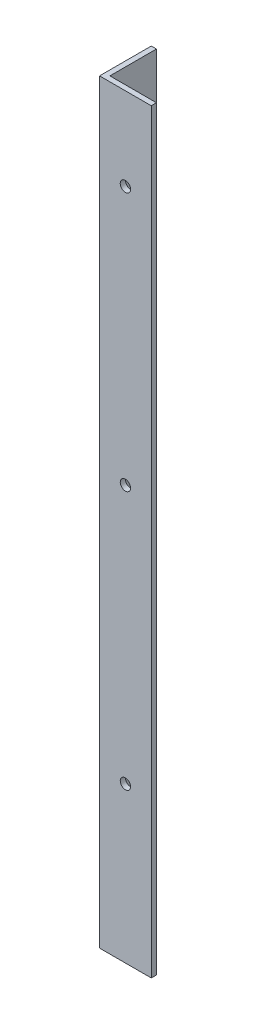
ISO-10303-21;
HEADER;
FILE_DESCRIPTION(('STEP AP214'),'2;1');
FILE_NAME('part.step','',(''),(''),'','','');
FILE_SCHEMA(('AUTOMOTIVE_DESIGN { 1 0 10303 214 1 1 1 1 }'));
ENDSEC;
DATA;
#1=APPLICATION_CONTEXT('core data for automotive mechanical design processes');
#2=APPLICATION_PROTOCOL_DEFINITION('international standard','automotive_design',2000,#1);
#3=PRODUCT_CONTEXT('',#1,'mechanical');
#4=PRODUCT('Part','Part','',(#3));
#5=PRODUCT_RELATED_PRODUCT_CATEGORY('part','',(#4));
#6=PRODUCT_DEFINITION_FORMATION('','',#4);
#7=PRODUCT_DEFINITION_CONTEXT('part definition',#1,'design');
#8=PRODUCT_DEFINITION('design','',#6,#7);
#9=PRODUCT_DEFINITION_SHAPE('','',#8);
#10=(LENGTH_UNIT() NAMED_UNIT(*) SI_UNIT(.MILLI.,.METRE.));
#11=(NAMED_UNIT(*) PLANE_ANGLE_UNIT() SI_UNIT($,.RADIAN.));
#12=(NAMED_UNIT(*) SI_UNIT($,.STERADIAN.) SOLID_ANGLE_UNIT());
#13=UNCERTAINTY_MEASURE_WITH_UNIT(LENGTH_MEASURE(1.E-05),#10,'distance_accuracy_value','');
#14=(GEOMETRIC_REPRESENTATION_CONTEXT(3) GLOBAL_UNCERTAINTY_ASSIGNED_CONTEXT((#13)) GLOBAL_UNIT_ASSIGNED_CONTEXT((#10,
#11,#12)) REPRESENTATION_CONTEXT('',''));
#15=CARTESIAN_POINT('',(0.,0.,0.));
#16=DIRECTION('',(0.,0.,1.));
#17=DIRECTION('',(1.,0.,0.));
#18=AXIS2_PLACEMENT_3D('',#15,#16,#17);
#19=CARTESIAN_POINT('',(0.,-146.,0.));
#20=DIRECTION('',(-1.,0.,0.));
#21=DIRECTION('',(0.,0.,1.));
#22=AXIS2_PLACEMENT_3D('',#19,#20,#21);
#23=PLANE('',#22);
#24=CARTESIAN_POINT('',(0.,-114.,-8.));
#25=DIRECTION('',(-1.,0.,0.));
#26=DIRECTION('',(0.,0.,1.));
#27=AXIS2_PLACEMENT_3D('',#24,#25,#26);
#28=CIRCLE('',#27,2.);
#29=CARTESIAN_POINT('',(0.,-114.,-6.));
#30=VERTEX_POINT('',#29);
#31=EDGE_CURVE('E169',#30,#30,#28,.T.);
#32=ORIENTED_EDGE('',*,*,#31,.F.);
#33=EDGE_LOOP('',(#32));
#34=FACE_BOUND('',#33,.T.);
#35=CARTESIAN_POINT('',(0.,-14.,-8.));
#36=DIRECTION('',(-1.,0.,0.));
#37=DIRECTION('',(0.,0.,1.));
#38=AXIS2_PLACEMENT_3D('',#35,#36,#37);
#39=CIRCLE('',#38,2.);
#40=CARTESIAN_POINT('',(0.,-14.,-6.));
#41=VERTEX_POINT('',#40);
#42=EDGE_CURVE('E327',#41,#41,#39,.T.);
#43=ORIENTED_EDGE('',*,*,#42,.F.);
#44=EDGE_LOOP('',(#43));
#45=FACE_BOUND('',#44,.T.);
#46=CARTESIAN_POINT('',(0.,86.,-8.));
#47=DIRECTION('',(-1.,0.,0.));
#48=DIRECTION('',(0.,0.,1.));
#49=AXIS2_PLACEMENT_3D('',#46,#47,#48);
#50=CIRCLE('',#49,2.);
#51=CARTESIAN_POINT('',(0.,86.,-6.));
#52=VERTEX_POINT('',#51);
#53=EDGE_CURVE('E331',#52,#52,#50,.T.);
#54=ORIENTED_EDGE('',*,*,#53,.F.);
#55=EDGE_LOOP('',(#54));
#56=FACE_BOUND('',#55,.T.);
#57=DIRECTION('',(0.,1.,0.));
#58=VECTOR('',#57,1.);
#59=CARTESIAN_POINT('',(0.,-146.,0.));
#60=LINE('',#59,#58);
#61=CARTESIAN_POINT('',(0.,-146.,0.));
#62=VERTEX_POINT('',#61);
#63=CARTESIAN_POINT('',(0.,146.,0.));
#64=VERTEX_POINT('',#63);
#65=EDGE_CURVE('E92',#62,#64,#60,.T.);
#66=ORIENTED_EDGE('',*,*,#65,.T.);
#67=DIRECTION('',(0.,0.,1.));
#68=VECTOR('',#67,1.);
#69=CARTESIAN_POINT('',(0.,146.,0.));
#70=LINE('',#69,#68);
#71=CARTESIAN_POINT('',(0.,146.,-20.));
#72=VERTEX_POINT('',#71);
#73=EDGE_CURVE('E95',#72,#64,#70,.T.);
#74=ORIENTED_EDGE('',*,*,#73,.F.);
#75=DIRECTION('',(0.,1.,0.));
#76=VECTOR('',#75,1.);
#77=CARTESIAN_POINT('',(0.,-146.,-20.));
#78=LINE('',#77,#76);
#79=CARTESIAN_POINT('',(0.,-146.,-20.));
#80=VERTEX_POINT('',#79);
#81=EDGE_CURVE('E11',#80,#72,#78,.T.);
#82=ORIENTED_EDGE('',*,*,#81,.F.);
#83=DIRECTION('',(0.,0.,1.));
#84=VECTOR('',#83,1.);
#85=CARTESIAN_POINT('',(0.,-146.,0.));
#86=LINE('',#85,#84);
#87=EDGE_CURVE('E96',#80,#62,#86,.T.);
#88=ORIENTED_EDGE('',*,*,#87,.T.);
#89=EDGE_LOOP('',(#66,#74,#82,#88));
#90=FACE_BOUND('',#89,.T.);
#91=ADVANCED_FACE('F41',(#34,#45,#56,#90),#23,.T.);
#92=CARTESIAN_POINT('',(0.,-146.,-20.));
#93=DIRECTION('',(0.,0.,-1.));
#94=DIRECTION('',(-1.,0.,0.));
#95=AXIS2_PLACEMENT_3D('',#92,#93,#94);
#96=PLANE('',#95);
#97=ORIENTED_EDGE('',*,*,#81,.T.);
#98=DIRECTION('',(-1.,0.,0.));
#99=VECTOR('',#98,1.);
#100=CARTESIAN_POINT('',(0.,146.,-20.));
#101=LINE('',#100,#99);
#102=CARTESIAN_POINT('',(2.,146.,-20.));
#103=VERTEX_POINT('',#102);
#104=EDGE_CURVE('E116',#103,#72,#101,.T.);
#105=ORIENTED_EDGE('',*,*,#104,.F.);
#106=DIRECTION('',(0.,1.,0.));
#107=VECTOR('',#106,1.);
#108=CARTESIAN_POINT('',(2.,-146.,-20.));
#109=LINE('',#108,#107);
#110=CARTESIAN_POINT('',(2.,-146.,-20.));
#111=VERTEX_POINT('',#110);
#112=EDGE_CURVE('E50',#111,#103,#109,.T.);
#113=ORIENTED_EDGE('',*,*,#112,.F.);
#114=DIRECTION('',(-1.,0.,0.));
#115=VECTOR('',#114,1.);
#116=CARTESIAN_POINT('',(0.,-146.,-20.));
#117=LINE('',#116,#115);
#118=EDGE_CURVE('E102',#111,#80,#117,.T.);
#119=ORIENTED_EDGE('',*,*,#118,.T.);
#120=EDGE_LOOP('',(#97,#105,#113,#119));
#121=FACE_BOUND('',#120,.T.);
#122=ADVANCED_FACE('F218',(#121),#96,.T.);
#123=CARTESIAN_POINT('',(2.,-146.,-20.));
#124=DIRECTION('',(1.,0.,0.));
#125=DIRECTION('',(0.,0.,-1.));
#126=AXIS2_PLACEMENT_3D('',#123,#124,#125);
#127=PLANE('',#126);
#128=CARTESIAN_POINT('',(2.,-114.,-8.));
#129=DIRECTION('',(1.,0.,0.));
#130=DIRECTION('',(0.,0.,-1.));
#131=AXIS2_PLACEMENT_3D('',#128,#129,#130);
#132=CIRCLE('',#131,2.);
#133=CARTESIAN_POINT('',(2.,-114.,-10.));
#134=VERTEX_POINT('',#133);
#135=EDGE_CURVE('E44',#134,#134,#132,.T.);
#136=ORIENTED_EDGE('',*,*,#135,.F.);
#137=EDGE_LOOP('',(#136));
#138=FACE_BOUND('',#137,.T.);
#139=CARTESIAN_POINT('',(2.,-14.,-8.));
#140=DIRECTION('',(1.,0.,0.));
#141=DIRECTION('',(0.,0.,-1.));
#142=AXIS2_PLACEMENT_3D('',#139,#140,#141);
#143=CIRCLE('',#142,2.);
#144=CARTESIAN_POINT('',(2.,-14.,-10.));
#145=VERTEX_POINT('',#144);
#146=EDGE_CURVE('E168',#145,#145,#143,.T.);
#147=ORIENTED_EDGE('',*,*,#146,.F.);
#148=EDGE_LOOP('',(#147));
#149=FACE_BOUND('',#148,.T.);
#150=CARTESIAN_POINT('',(2.,86.,-8.));
#151=DIRECTION('',(1.,0.,0.));
#152=DIRECTION('',(0.,0.,-1.));
#153=AXIS2_PLACEMENT_3D('',#150,#151,#152);
#154=CIRCLE('',#153,2.);
#155=CARTESIAN_POINT('',(2.,86.,-10.));
#156=VERTEX_POINT('',#155);
#157=EDGE_CURVE('E165',#156,#156,#154,.T.);
#158=ORIENTED_EDGE('',*,*,#157,.F.);
#159=EDGE_LOOP('',(#158));
#160=FACE_BOUND('',#159,.T.);
#161=ORIENTED_EDGE('',*,*,#112,.T.);
#162=DIRECTION('',(0.,0.,-1.));
#163=VECTOR('',#162,1.);
#164=CARTESIAN_POINT('',(2.,146.,-20.));
#165=LINE('',#164,#163);
#166=CARTESIAN_POINT('',(2.,146.,-2.));
#167=VERTEX_POINT('',#166);
#168=EDGE_CURVE('E132',#167,#103,#165,.T.);
#169=ORIENTED_EDGE('',*,*,#168,.F.);
#170=DIRECTION('',(0.,1.,0.));
#171=VECTOR('',#170,1.);
#172=CARTESIAN_POINT('',(2.,-146.,-2.));
#173=LINE('',#172,#171);
#174=CARTESIAN_POINT('',(2.,-146.,-2.));
#175=VERTEX_POINT('',#174);
#176=EDGE_CURVE('E157',#175,#167,#173,.T.);
#177=ORIENTED_EDGE('',*,*,#176,.F.);
#178=DIRECTION('',(0.,0.,-1.));
#179=VECTOR('',#178,1.);
#180=CARTESIAN_POINT('',(2.,-146.,-20.));
#181=LINE('',#180,#179);
#182=EDGE_CURVE('E150',#175,#111,#181,.T.);
#183=ORIENTED_EDGE('',*,*,#182,.T.);
#184=EDGE_LOOP('',(#161,#169,#177,#183));
#185=FACE_BOUND('',#184,.T.);
#186=ADVANCED_FACE('F205',(#138,#149,#160,#185),#127,.T.);
#187=CARTESIAN_POINT('',(20.,-146.,-2.));
#188=DIRECTION('',(0.,0.,-1.));
#189=DIRECTION('',(-1.,0.,0.));
#190=AXIS2_PLACEMENT_3D('',#187,#188,#189);
#191=PLANE('',#190);
#192=CARTESIAN_POINT('',(10.,114.,-2.));
#193=DIRECTION('',(0.,0.,-1.));
#194=DIRECTION('',(-1.,0.,0.));
#195=AXIS2_PLACEMENT_3D('',#192,#193,#194);
#196=CIRCLE('',#195,2.);
#197=CARTESIAN_POINT('',(8.00000000000001,114.,-2.));
#198=VERTEX_POINT('',#197);
#199=EDGE_CURVE('E118',#198,#198,#196,.T.);
#200=ORIENTED_EDGE('',*,*,#199,.F.);
#201=EDGE_LOOP('',(#200));
#202=FACE_BOUND('',#201,.T.);
#203=CARTESIAN_POINT('',(10.,14.,-2.));
#204=DIRECTION('',(0.,0.,-1.));
#205=DIRECTION('',(-1.,0.,0.));
#206=AXIS2_PLACEMENT_3D('',#203,#204,#205);
#207=CIRCLE('',#206,2.);
#208=CARTESIAN_POINT('',(8.00000000000002,14.,-2.));
#209=VERTEX_POINT('',#208);
#210=EDGE_CURVE('E122',#209,#209,#207,.T.);
#211=ORIENTED_EDGE('',*,*,#210,.F.);
#212=EDGE_LOOP('',(#211));
#213=FACE_BOUND('',#212,.T.);
#214=CARTESIAN_POINT('',(10.,-86.,-2.));
#215=DIRECTION('',(0.,0.,-1.));
#216=DIRECTION('',(-1.,0.,0.));
#217=AXIS2_PLACEMENT_3D('',#214,#215,#216);
#218=CIRCLE('',#217,2.);
#219=CARTESIAN_POINT('',(8.00000000000003,-86.,-2.));
#220=VERTEX_POINT('',#219);
#221=EDGE_CURVE('E191',#220,#220,#218,.T.);
#222=ORIENTED_EDGE('',*,*,#221,.F.);
#223=EDGE_LOOP('',(#222));
#224=FACE_BOUND('',#223,.T.);
#225=ORIENTED_EDGE('',*,*,#176,.T.);
#226=DIRECTION('',(-1.,0.,0.));
#227=VECTOR('',#226,1.);
#228=CARTESIAN_POINT('',(20.,146.,-2.));
#229=LINE('',#228,#227);
#230=CARTESIAN_POINT('',(20.,146.,-2.));
#231=VERTEX_POINT('',#230);
#232=EDGE_CURVE('E128',#231,#167,#229,.T.);
#233=ORIENTED_EDGE('',*,*,#232,.F.);
#234=DIRECTION('',(0.,1.,0.));
#235=VECTOR('',#234,1.);
#236=CARTESIAN_POINT('',(20.,-146.,-2.));
#237=LINE('',#236,#235);
#238=CARTESIAN_POINT('',(20.,-146.,-2.));
#239=VERTEX_POINT('',#238);
#240=EDGE_CURVE('E160',#239,#231,#237,.T.);
#241=ORIENTED_EDGE('',*,*,#240,.F.);
#242=DIRECTION('',(-1.,0.,0.));
#243=VECTOR('',#242,1.);
#244=CARTESIAN_POINT('',(20.,-146.,-2.));
#245=LINE('',#244,#243);
#246=EDGE_CURVE('E146',#239,#175,#245,.T.);
#247=ORIENTED_EDGE('',*,*,#246,.T.);
#248=EDGE_LOOP('',(#225,#233,#241,#247));
#249=FACE_BOUND('',#248,.T.);
#250=ADVANCED_FACE('F201',(#202,#213,#224,#249),#191,.T.);
#251=CARTESIAN_POINT('',(20.,-146.,0.));
#252=DIRECTION('',(1.,0.,0.));
#253=DIRECTION('',(0.,0.,-1.));
#254=AXIS2_PLACEMENT_3D('',#251,#252,#253);
#255=PLANE('',#254);
#256=ORIENTED_EDGE('',*,*,#240,.T.);
#257=DIRECTION('',(0.,0.,-1.));
#258=VECTOR('',#257,1.);
#259=CARTESIAN_POINT('',(20.,146.,0.));
#260=LINE('',#259,#258);
#261=CARTESIAN_POINT('',(20.,146.,0.));
#262=VERTEX_POINT('',#261);
#263=EDGE_CURVE('E111',#262,#231,#260,.T.);
#264=ORIENTED_EDGE('',*,*,#263,.F.);
#265=DIRECTION('',(0.,1.,0.));
#266=VECTOR('',#265,1.);
#267=CARTESIAN_POINT('',(20.,-146.,0.));
#268=LINE('',#267,#266);
#269=CARTESIAN_POINT('',(20.,-146.,0.));
#270=VERTEX_POINT('',#269);
#271=EDGE_CURVE('E101',#270,#262,#268,.T.);
#272=ORIENTED_EDGE('',*,*,#271,.F.);
#273=DIRECTION('',(0.,0.,-1.));
#274=VECTOR('',#273,1.);
#275=CARTESIAN_POINT('',(20.,-146.,0.));
#276=LINE('',#275,#274);
#277=EDGE_CURVE('E142',#270,#239,#276,.T.);
#278=ORIENTED_EDGE('',*,*,#277,.T.);
#279=EDGE_LOOP('',(#256,#264,#272,#278));
#280=FACE_BOUND('',#279,.T.);
#281=ADVANCED_FACE('F204',(#280),#255,.T.);
#282=CARTESIAN_POINT('',(0.,-146.,0.));
#283=DIRECTION('',(0.,0.,1.));
#284=DIRECTION('',(1.,0.,0.));
#285=AXIS2_PLACEMENT_3D('',#282,#283,#284);
#286=PLANE('',#285);
#287=CARTESIAN_POINT('',(10.,114.,0.));
#288=DIRECTION('',(0.,0.,1.));
#289=DIRECTION('',(1.,0.,0.));
#290=AXIS2_PLACEMENT_3D('',#287,#288,#289);
#291=CIRCLE('',#290,2.);
#292=CARTESIAN_POINT('',(12.,114.,0.));
#293=VERTEX_POINT('',#292);
#294=EDGE_CURVE('E187',#293,#293,#291,.T.);
#295=ORIENTED_EDGE('',*,*,#294,.F.);
#296=EDGE_LOOP('',(#295));
#297=FACE_BOUND('',#296,.T.);
#298=CARTESIAN_POINT('',(10.,14.,0.));
#299=DIRECTION('',(0.,0.,1.));
#300=DIRECTION('',(1.,0.,0.));
#301=AXIS2_PLACEMENT_3D('',#298,#299,#300);
#302=CIRCLE('',#301,2.);
#303=CARTESIAN_POINT('',(12.,14.,0.));
#304=VERTEX_POINT('',#303);
#305=EDGE_CURVE('E181',#304,#304,#302,.T.);
#306=ORIENTED_EDGE('',*,*,#305,.F.);
#307=EDGE_LOOP('',(#306));
#308=FACE_BOUND('',#307,.T.);
#309=CARTESIAN_POINT('',(10.,-86.,0.));
#310=DIRECTION('',(0.,0.,1.));
#311=DIRECTION('',(1.,0.,0.));
#312=AXIS2_PLACEMENT_3D('',#309,#310,#311);
#313=CIRCLE('',#312,2.);
#314=CARTESIAN_POINT('',(12.,-86.,0.));
#315=VERTEX_POINT('',#314);
#316=EDGE_CURVE('E176',#315,#315,#313,.T.);
#317=ORIENTED_EDGE('',*,*,#316,.F.);
#318=EDGE_LOOP('',(#317));
#319=FACE_BOUND('',#318,.T.);
#320=ORIENTED_EDGE('',*,*,#271,.T.);
#321=DIRECTION('',(1.,0.,0.));
#322=VECTOR('',#321,1.);
#323=CARTESIAN_POINT('',(0.,146.,0.));
#324=LINE('',#323,#322);
#325=EDGE_CURVE('E105',#64,#262,#324,.T.);
#326=ORIENTED_EDGE('',*,*,#325,.F.);
#327=ORIENTED_EDGE('',*,*,#65,.F.);
#328=DIRECTION('',(1.,0.,0.));
#329=VECTOR('',#328,1.);
#330=CARTESIAN_POINT('',(0.,-146.,0.));
#331=LINE('',#330,#329);
#332=EDGE_CURVE('E139',#62,#270,#331,.T.);
#333=ORIENTED_EDGE('',*,*,#332,.T.);
#334=EDGE_LOOP('',(#320,#326,#327,#333));
#335=FACE_BOUND('',#334,.T.);
#336=ADVANCED_FACE('F106',(#297,#308,#319,#335),#286,.T.);
#337=CARTESIAN_POINT('',(0.,-146.,0.));
#338=DIRECTION('',(0.,-1.,0.));
#339=DIRECTION('',(0.,0.,-1.));
#340=AXIS2_PLACEMENT_3D('',#337,#338,#339);
#341=PLANE('',#340);
#342=ORIENTED_EDGE('',*,*,#87,.F.);
#343=ORIENTED_EDGE('',*,*,#118,.F.);
#344=ORIENTED_EDGE('',*,*,#182,.F.);
#345=ORIENTED_EDGE('',*,*,#246,.F.);
#346=ORIENTED_EDGE('',*,*,#277,.F.);
#347=ORIENTED_EDGE('',*,*,#332,.F.);
#348=EDGE_LOOP('',(#342,#343,#344,#345,#346,#347));
#349=FACE_BOUND('',#348,.T.);
#350=ADVANCED_FACE('F217',(#349),#341,.T.);
#351=CARTESIAN_POINT('',(0.,146.,0.));
#352=DIRECTION('',(0.,-1.,0.));
#353=DIRECTION('',(0.,0.,-1.));
#354=AXIS2_PLACEMENT_3D('',#351,#352,#353);
#355=PLANE('',#354);
#356=ORIENTED_EDGE('',*,*,#73,.T.);
#357=ORIENTED_EDGE('',*,*,#325,.T.);
#358=ORIENTED_EDGE('',*,*,#263,.T.);
#359=ORIENTED_EDGE('',*,*,#232,.T.);
#360=ORIENTED_EDGE('',*,*,#168,.T.);
#361=ORIENTED_EDGE('',*,*,#104,.T.);
#362=EDGE_LOOP('',(#356,#357,#358,#359,#360,#361));
#363=FACE_BOUND('',#362,.T.);
#364=ADVANCED_FACE('F114',(#363),#355,.F.);
#365=CARTESIAN_POINT('',(10.,-86.,-10.));
#366=DIRECTION('',(0.,0.,1.));
#367=DIRECTION('',(1.,0.,0.));
#368=AXIS2_PLACEMENT_3D('',#365,#366,#367);
#369=CYLINDRICAL_SURFACE('',#368,2.);
#370=ORIENTED_EDGE('',*,*,#221,.T.);
#371=EDGE_LOOP('',(#370));
#372=FACE_BOUND('',#371,.T.);
#373=ORIENTED_EDGE('',*,*,#316,.T.);
#374=EDGE_LOOP('',(#373));
#375=FACE_BOUND('',#374,.T.);
#376=ADVANCED_FACE('F245',(#372,#375),#369,.F.);
#377=CARTESIAN_POINT('',(10.,14.,-10.));
#378=DIRECTION('',(0.,0.,1.));
#379=DIRECTION('',(1.,0.,0.));
#380=AXIS2_PLACEMENT_3D('',#377,#378,#379);
#381=CYLINDRICAL_SURFACE('',#380,2.);
#382=ORIENTED_EDGE('',*,*,#210,.T.);
#383=EDGE_LOOP('',(#382));
#384=FACE_BOUND('',#383,.T.);
#385=ORIENTED_EDGE('',*,*,#305,.T.);
#386=EDGE_LOOP('',(#385));
#387=FACE_BOUND('',#386,.T.);
#388=ADVANCED_FACE('F198',(#384,#387),#381,.F.);
#389=CARTESIAN_POINT('',(10.,114.,-10.));
#390=DIRECTION('',(0.,0.,1.));
#391=DIRECTION('',(1.,0.,0.));
#392=AXIS2_PLACEMENT_3D('',#389,#390,#391);
#393=CYLINDRICAL_SURFACE('',#392,2.);
#394=ORIENTED_EDGE('',*,*,#199,.T.);
#395=EDGE_LOOP('',(#394));
#396=FACE_BOUND('',#395,.T.);
#397=ORIENTED_EDGE('',*,*,#294,.T.);
#398=EDGE_LOOP('',(#397));
#399=FACE_BOUND('',#398,.T.);
#400=ADVANCED_FACE('F244',(#396,#399),#393,.F.);
#401=CARTESIAN_POINT('',(10.,86.,-8.));
#402=DIRECTION('',(-1.,0.,0.));
#403=DIRECTION('',(0.,0.,1.));
#404=AXIS2_PLACEMENT_3D('',#401,#402,#403);
#405=CYLINDRICAL_SURFACE('',#404,2.);
#406=ORIENTED_EDGE('',*,*,#157,.T.);
#407=EDGE_LOOP('',(#406));
#408=FACE_BOUND('',#407,.T.);
#409=ORIENTED_EDGE('',*,*,#53,.T.);
#410=EDGE_LOOP('',(#409));
#411=FACE_BOUND('',#410,.T.);
#412=ADVANCED_FACE('F251',(#408,#411),#405,.F.);
#413=CARTESIAN_POINT('',(10.,-14.,-8.));
#414=DIRECTION('',(-1.,0.,0.));
#415=DIRECTION('',(0.,0.,1.));
#416=AXIS2_PLACEMENT_3D('',#413,#414,#415);
#417=CYLINDRICAL_SURFACE('',#416,2.);
#418=ORIENTED_EDGE('',*,*,#146,.T.);
#419=EDGE_LOOP('',(#418));
#420=FACE_BOUND('',#419,.T.);
#421=ORIENTED_EDGE('',*,*,#42,.T.);
#422=EDGE_LOOP('',(#421));
#423=FACE_BOUND('',#422,.T.);
#424=ADVANCED_FACE('F302',(#420,#423),#417,.F.);
#425=CARTESIAN_POINT('',(10.,-114.,-8.));
#426=DIRECTION('',(-1.,0.,0.));
#427=DIRECTION('',(0.,0.,1.));
#428=AXIS2_PLACEMENT_3D('',#425,#426,#427);
#429=CYLINDRICAL_SURFACE('',#428,2.);
#430=ORIENTED_EDGE('',*,*,#135,.T.);
#431=EDGE_LOOP('',(#430));
#432=FACE_BOUND('',#431,.T.);
#433=ORIENTED_EDGE('',*,*,#31,.T.);
#434=EDGE_LOOP('',(#433));
#435=FACE_BOUND('',#434,.T.);
#436=ADVANCED_FACE('F311',(#432,#435),#429,.F.);
#437=CLOSED_SHELL('',(#91,#122,#186,#250,#281,#336,#350,#364,#376,#388,#400,#412,#424,#436));
#438=MANIFOLD_SOLID_BREP('B2',#437);
#439=ADVANCED_BREP_SHAPE_REPRESENTATION('',(#18,#438),#14);
#440=SHAPE_DEFINITION_REPRESENTATION(#9,#439);
ENDSEC;
END-ISO-10303-21;
